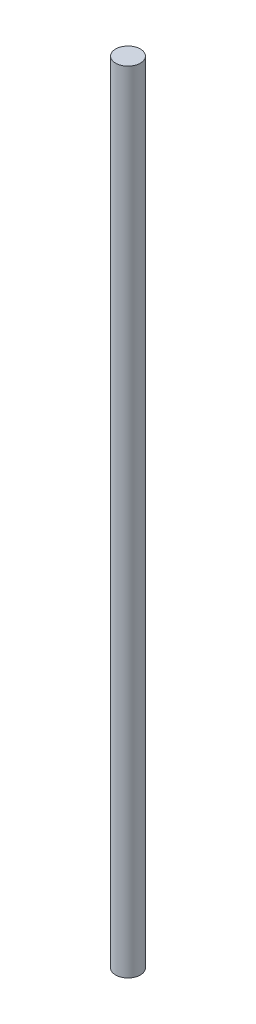
ISO-10303-21;
HEADER;
FILE_DESCRIPTION(('STEP AP214'),'2;1');
FILE_NAME('part.step','',(''),(''),'','','');
FILE_SCHEMA(('AUTOMOTIVE_DESIGN { 1 0 10303 214 1 1 1 1 }'));
ENDSEC;
DATA;
#1=APPLICATION_CONTEXT('core data for automotive mechanical design processes');
#2=APPLICATION_PROTOCOL_DEFINITION('international standard','automotive_design',2000,#1);
#3=PRODUCT_CONTEXT('',#1,'mechanical');
#4=PRODUCT('Part','Part','',(#3));
#5=PRODUCT_RELATED_PRODUCT_CATEGORY('part','',(#4));
#6=PRODUCT_DEFINITION_FORMATION('','',#4);
#7=PRODUCT_DEFINITION_CONTEXT('part definition',#1,'design');
#8=PRODUCT_DEFINITION('design','',#6,#7);
#9=PRODUCT_DEFINITION_SHAPE('','',#8);
#10=(LENGTH_UNIT() NAMED_UNIT(*) SI_UNIT(.MILLI.,.METRE.));
#11=(NAMED_UNIT(*) PLANE_ANGLE_UNIT() SI_UNIT($,.RADIAN.));
#12=(NAMED_UNIT(*) SI_UNIT($,.STERADIAN.) SOLID_ANGLE_UNIT());
#13=UNCERTAINTY_MEASURE_WITH_UNIT(LENGTH_MEASURE(1.E-05),#10,'distance_accuracy_value','');
#14=(GEOMETRIC_REPRESENTATION_CONTEXT(3) GLOBAL_UNCERTAINTY_ASSIGNED_CONTEXT((#13)) GLOBAL_UNIT_ASSIGNED_CONTEXT((#10,
#11,#12)) REPRESENTATION_CONTEXT('',''));
#15=CARTESIAN_POINT('',(0.,0.,0.));
#16=DIRECTION('',(0.,0.,1.));
#17=DIRECTION('',(1.,0.,0.));
#18=AXIS2_PLACEMENT_3D('',#15,#16,#17);
#19=CARTESIAN_POINT('',(0.,406.4,0.));
#20=DIRECTION('',(0.,-1.,0.));
#21=DIRECTION('',(0.,0.,-1.));
#22=AXIS2_PLACEMENT_3D('',#19,#20,#21);
#23=CYLINDRICAL_SURFACE('',#22,6.35);
#24=CARTESIAN_POINT('',(0.,406.4,0.));
#25=DIRECTION('',(0.,1.,0.));
#26=DIRECTION('',(0.,0.,1.));
#27=AXIS2_PLACEMENT_3D('',#24,#25,#26);
#28=CIRCLE('',#27,6.35);
#29=CARTESIAN_POINT('',(0.,406.4,6.35));
#30=VERTEX_POINT('',#29);
#31=EDGE_CURVE('E10',#30,#30,#28,.T.);
#32=ORIENTED_EDGE('',*,*,#31,.F.);
#33=EDGE_LOOP('',(#32));
#34=FACE_BOUND('',#33,.T.);
#35=CARTESIAN_POINT('',(0.,0.,0.));
#36=DIRECTION('',(0.,1.,0.));
#37=DIRECTION('',(0.,0.,1.));
#38=AXIS2_PLACEMENT_3D('',#35,#36,#37);
#39=CIRCLE('',#38,6.35);
#40=CARTESIAN_POINT('',(0.,0.,6.35));
#41=VERTEX_POINT('',#40);
#42=EDGE_CURVE('E40',#41,#41,#39,.T.);
#43=ORIENTED_EDGE('',*,*,#42,.T.);
#44=EDGE_LOOP('',(#43));
#45=FACE_BOUND('',#44,.T.);
#46=ADVANCED_FACE('F37',(#34,#45),#23,.T.);
#47=CARTESIAN_POINT('',(0.,406.4,0.));
#48=DIRECTION('',(0.,1.,0.));
#49=DIRECTION('',(0.,0.,1.));
#50=AXIS2_PLACEMENT_3D('',#47,#48,#49);
#51=PLANE('',#50);
#52=ORIENTED_EDGE('',*,*,#31,.T.);
#53=EDGE_LOOP('',(#52));
#54=FACE_BOUND('',#53,.T.);
#55=ADVANCED_FACE('F54',(#54),#51,.T.);
#56=CARTESIAN_POINT('',(0.,0.,0.));
#57=DIRECTION('',(0.,1.,0.));
#58=DIRECTION('',(0.,0.,1.));
#59=AXIS2_PLACEMENT_3D('',#56,#57,#58);
#60=PLANE('',#59);
#61=ORIENTED_EDGE('',*,*,#42,.F.);
#62=EDGE_LOOP('',(#61));
#63=FACE_BOUND('',#62,.T.);
#64=ADVANCED_FACE('F52',(#63),#60,.F.);
#65=CLOSED_SHELL('',(#46,#55,#64));
#66=MANIFOLD_SOLID_BREP('B2',#65);
#67=ADVANCED_BREP_SHAPE_REPRESENTATION('',(#18,#66),#14);
#68=SHAPE_DEFINITION_REPRESENTATION(#9,#67);
ENDSEC;
END-ISO-10303-21;
